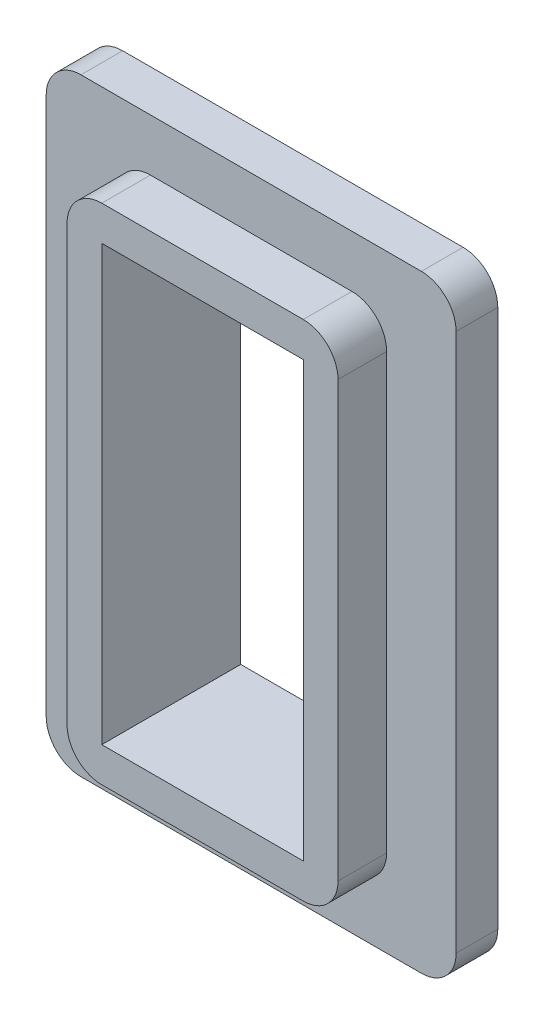
ISO-10303-21;
HEADER;
FILE_DESCRIPTION(('STEP AP214'),'2;1');
FILE_NAME('part.step','',(''),(''),'','','');
FILE_SCHEMA(('AUTOMOTIVE_DESIGN { 1 0 10303 214 1 1 1 1 }'));
ENDSEC;
DATA;
#1=APPLICATION_CONTEXT('core data for automotive mechanical design processes');
#2=APPLICATION_PROTOCOL_DEFINITION('international standard','automotive_design',2000,#1);
#3=PRODUCT_CONTEXT('',#1,'mechanical');
#4=PRODUCT('Part','Part','',(#3));
#5=PRODUCT_RELATED_PRODUCT_CATEGORY('part','',(#4));
#6=PRODUCT_DEFINITION_FORMATION('','',#4);
#7=PRODUCT_DEFINITION_CONTEXT('part definition',#1,'design');
#8=PRODUCT_DEFINITION('design','',#6,#7);
#9=PRODUCT_DEFINITION_SHAPE('','',#8);
#10=(LENGTH_UNIT() NAMED_UNIT(*) SI_UNIT(.MILLI.,.METRE.));
#11=(NAMED_UNIT(*) PLANE_ANGLE_UNIT() SI_UNIT($,.RADIAN.));
#12=(NAMED_UNIT(*) SI_UNIT($,.STERADIAN.) SOLID_ANGLE_UNIT());
#13=UNCERTAINTY_MEASURE_WITH_UNIT(LENGTH_MEASURE(1.E-05),#10,'distance_accuracy_value','');
#14=(GEOMETRIC_REPRESENTATION_CONTEXT(3) GLOBAL_UNCERTAINTY_ASSIGNED_CONTEXT((#13)) GLOBAL_UNIT_ASSIGNED_CONTEXT((#10,
#11,#12)) REPRESENTATION_CONTEXT('',''));
#15=CARTESIAN_POINT('',(0.,0.,0.));
#16=DIRECTION('',(0.,0.,1.));
#17=DIRECTION('',(1.,0.,0.));
#18=AXIS2_PLACEMENT_3D('',#15,#16,#17);
#19=CARTESIAN_POINT('',(0.,0.,-0.6));
#20=DIRECTION('',(0.,0.,1.));
#21=DIRECTION('',(1.,0.,0.));
#22=AXIS2_PLACEMENT_3D('',#19,#20,#21);
#23=PLANE('',#22);
#24=DIRECTION('',(-1.,0.,0.));
#25=VECTOR('',#24,1.);
#26=CARTESIAN_POINT('',(0.,-8.75,-0.6));
#27=LINE('',#26,#25);
#28=CARTESIAN_POINT('',(4.9,-8.75,-0.6));
#29=VERTEX_POINT('',#28);
#30=CARTESIAN_POINT('',(-4.9,-8.75,-0.6));
#31=VERTEX_POINT('',#30);
#32=EDGE_CURVE('E360',#29,#31,#27,.T.);
#33=ORIENTED_EDGE('',*,*,#32,.T.);
#34=CARTESIAN_POINT('',(-4.9,-7.75,-0.6));
#35=DIRECTION('',(0.,0.,1.));
#36=DIRECTION('',(1.,0.,0.));
#37=AXIS2_PLACEMENT_3D('',#34,#35,#36);
#38=CIRCLE('',#37,1.);
#39=CARTESIAN_POINT('',(-5.9,-7.75,-0.6));
#40=VERTEX_POINT('',#39);
#41=EDGE_CURVE('E433',#31,#40,#38,.F.);
#42=ORIENTED_EDGE('',*,*,#41,.T.);
#43=DIRECTION('',(0.,1.,0.));
#44=VECTOR('',#43,1.);
#45=CARTESIAN_POINT('',(-5.9,0.,-0.6));
#46=LINE('',#45,#44);
#47=CARTESIAN_POINT('',(-5.9,7.75,-0.6));
#48=VERTEX_POINT('',#47);
#49=EDGE_CURVE('E357',#40,#48,#46,.T.);
#50=ORIENTED_EDGE('',*,*,#49,.T.);
#51=CARTESIAN_POINT('',(-4.9,7.75,-0.6));
#52=DIRECTION('',(0.,0.,1.));
#53=DIRECTION('',(1.,0.,0.));
#54=AXIS2_PLACEMENT_3D('',#51,#52,#53);
#55=CIRCLE('',#54,1.);
#56=CARTESIAN_POINT('',(-4.9,8.75,-0.6));
#57=VERTEX_POINT('',#56);
#58=EDGE_CURVE('E427',#48,#57,#55,.F.);
#59=ORIENTED_EDGE('',*,*,#58,.T.);
#60=DIRECTION('',(-1.,0.,0.));
#61=VECTOR('',#60,1.);
#62=CARTESIAN_POINT('',(0.,8.75,-0.6));
#63=LINE('',#62,#61);
#64=CARTESIAN_POINT('',(4.9,8.75,-0.6));
#65=VERTEX_POINT('',#64);
#66=EDGE_CURVE('E366',#65,#57,#63,.T.);
#67=ORIENTED_EDGE('',*,*,#66,.F.);
#68=CARTESIAN_POINT('',(4.9,7.75,-0.6));
#69=DIRECTION('',(0.,0.,1.));
#70=DIRECTION('',(1.,0.,0.));
#71=AXIS2_PLACEMENT_3D('',#68,#69,#70);
#72=CIRCLE('',#71,1.);
#73=CARTESIAN_POINT('',(5.9,7.75,-0.6));
#74=VERTEX_POINT('',#73);
#75=EDGE_CURVE('E429',#65,#74,#72,.F.);
#76=ORIENTED_EDGE('',*,*,#75,.T.);
#77=DIRECTION('',(0.,1.,0.));
#78=VECTOR('',#77,1.);
#79=CARTESIAN_POINT('',(5.9,0.,-0.6));
#80=LINE('',#79,#78);
#81=CARTESIAN_POINT('',(5.9,-7.75,-0.6));
#82=VERTEX_POINT('',#81);
#83=EDGE_CURVE('E363',#82,#74,#80,.T.);
#84=ORIENTED_EDGE('',*,*,#83,.F.);
#85=CARTESIAN_POINT('',(4.9,-7.75,-0.6));
#86=DIRECTION('',(0.,0.,1.));
#87=DIRECTION('',(1.,0.,0.));
#88=AXIS2_PLACEMENT_3D('',#85,#86,#87);
#89=CIRCLE('',#88,1.);
#90=EDGE_CURVE('E431',#82,#29,#89,.F.);
#91=ORIENTED_EDGE('',*,*,#90,.T.);
#92=EDGE_LOOP('',(#33,#42,#50,#59,#67,#76,#84,#91));
#93=FACE_BOUND('',#92,.T.);
#94=DIRECTION('',(0.,1.,0.));
#95=VECTOR('',#94,1.);
#96=CARTESIAN_POINT('',(-3.9,0.,-0.6));
#97=LINE('',#96,#95);
#98=CARTESIAN_POINT('',(-3.9,-6.25,-0.6));
#99=VERTEX_POINT('',#98);
#100=CARTESIAN_POINT('',(-3.9,6.25,-0.6));
#101=VERTEX_POINT('',#100);
#102=EDGE_CURVE('E342',#99,#101,#97,.T.);
#103=ORIENTED_EDGE('',*,*,#102,.F.);
#104=CARTESIAN_POINT('',(-2.9,-6.25,-0.6));
#105=DIRECTION('',(0.,0.,1.));
#106=DIRECTION('',(1.,0.,0.));
#107=AXIS2_PLACEMENT_3D('',#104,#105,#106);
#108=CIRCLE('',#107,1.);
#109=CARTESIAN_POINT('',(-2.9,-7.25,-0.6));
#110=VERTEX_POINT('',#109);
#111=EDGE_CURVE('E476',#99,#110,#108,.T.);
#112=ORIENTED_EDGE('',*,*,#111,.T.);
#113=DIRECTION('',(1.,0.,0.));
#114=VECTOR('',#113,1.);
#115=CARTESIAN_POINT('',(0.,-7.25,-0.6));
#116=LINE('',#115,#114);
#117=CARTESIAN_POINT('',(2.9,-7.25,-0.6));
#118=VERTEX_POINT('',#117);
#119=EDGE_CURVE('E333',#110,#118,#116,.T.);
#120=ORIENTED_EDGE('',*,*,#119,.T.);
#121=CARTESIAN_POINT('',(2.9,-6.25,-0.6));
#122=DIRECTION('',(0.,0.,1.));
#123=DIRECTION('',(1.,0.,0.));
#124=AXIS2_PLACEMENT_3D('',#121,#122,#123);
#125=CIRCLE('',#124,1.);
#126=CARTESIAN_POINT('',(3.9,-6.25,-0.6));
#127=VERTEX_POINT('',#126);
#128=EDGE_CURVE('E474',#118,#127,#125,.T.);
#129=ORIENTED_EDGE('',*,*,#128,.T.);
#130=DIRECTION('',(0.,1.,0.));
#131=VECTOR('',#130,1.);
#132=CARTESIAN_POINT('',(3.9,0.,-0.6));
#133=LINE('',#132,#131);
#134=CARTESIAN_POINT('',(3.9,6.25,-0.6));
#135=VERTEX_POINT('',#134);
#136=EDGE_CURVE('E336',#127,#135,#133,.T.);
#137=ORIENTED_EDGE('',*,*,#136,.T.);
#138=CARTESIAN_POINT('',(2.9,6.25,-0.6));
#139=DIRECTION('',(0.,0.,1.));
#140=DIRECTION('',(1.,0.,0.));
#141=AXIS2_PLACEMENT_3D('',#138,#139,#140);
#142=CIRCLE('',#141,1.);
#143=CARTESIAN_POINT('',(2.9,7.25,-0.6));
#144=VERTEX_POINT('',#143);
#145=EDGE_CURVE('E472',#135,#144,#142,.T.);
#146=ORIENTED_EDGE('',*,*,#145,.T.);
#147=DIRECTION('',(1.,0.,0.));
#148=VECTOR('',#147,1.);
#149=CARTESIAN_POINT('',(0.,7.25,-0.6));
#150=LINE('',#149,#148);
#151=CARTESIAN_POINT('',(-2.9,7.25,-0.6));
#152=VERTEX_POINT('',#151);
#153=EDGE_CURVE('E339',#152,#144,#150,.T.);
#154=ORIENTED_EDGE('',*,*,#153,.F.);
#155=CARTESIAN_POINT('',(-2.9,6.25,-0.6));
#156=DIRECTION('',(0.,0.,1.));
#157=DIRECTION('',(1.,0.,0.));
#158=AXIS2_PLACEMENT_3D('',#155,#156,#157);
#159=CIRCLE('',#158,1.);
#160=EDGE_CURVE('E470',#152,#101,#159,.T.);
#161=ORIENTED_EDGE('',*,*,#160,.T.);
#162=EDGE_LOOP('',(#103,#112,#120,#129,#137,#146,#154,#161));
#163=FACE_BOUND('',#162,.T.);
#164=ADVANCED_FACE('F83',(#93,#163),#23,.F.);
#165=CARTESIAN_POINT('',(0.,0.,0.6));
#166=DIRECTION('',(0.,0.,1.));
#167=DIRECTION('',(1.,0.,0.));
#168=AXIS2_PLACEMENT_3D('',#165,#166,#167);
#169=PLANE('',#168);
#170=DIRECTION('',(0.,1.,0.));
#171=VECTOR('',#170,1.);
#172=CARTESIAN_POINT('',(-5.9,0.,0.6));
#173=LINE('',#172,#171);
#174=CARTESIAN_POINT('',(-5.9,-7.75,0.6));
#175=VERTEX_POINT('',#174);
#176=CARTESIAN_POINT('',(-5.9,7.75,0.6));
#177=VERTEX_POINT('',#176);
#178=EDGE_CURVE('E345',#175,#177,#173,.T.);
#179=ORIENTED_EDGE('',*,*,#178,.F.);
#180=CARTESIAN_POINT('',(-4.9,-7.75,0.6));
#181=DIRECTION('',(0.,0.,1.));
#182=DIRECTION('',(1.,0.,0.));
#183=AXIS2_PLACEMENT_3D('',#180,#181,#182);
#184=CIRCLE('',#183,1.);
#185=CARTESIAN_POINT('',(-4.9,-8.75,0.6));
#186=VERTEX_POINT('',#185);
#187=EDGE_CURVE('E420',#175,#186,#184,.T.);
#188=ORIENTED_EDGE('',*,*,#187,.T.);
#189=DIRECTION('',(-1.,0.,0.));
#190=VECTOR('',#189,1.);
#191=CARTESIAN_POINT('',(0.,-8.75,0.6));
#192=LINE('',#191,#190);
#193=CARTESIAN_POINT('',(4.9,-8.75,0.6));
#194=VERTEX_POINT('',#193);
#195=EDGE_CURVE('E348',#194,#186,#192,.T.);
#196=ORIENTED_EDGE('',*,*,#195,.F.);
#197=CARTESIAN_POINT('',(4.9,-7.75,0.6));
#198=DIRECTION('',(0.,0.,1.));
#199=DIRECTION('',(1.,0.,0.));
#200=AXIS2_PLACEMENT_3D('',#197,#198,#199);
#201=CIRCLE('',#200,1.);
#202=CARTESIAN_POINT('',(5.9,-7.75,0.6));
#203=VERTEX_POINT('',#202);
#204=EDGE_CURVE('E418',#194,#203,#201,.T.);
#205=ORIENTED_EDGE('',*,*,#204,.T.);
#206=DIRECTION('',(0.,1.,0.));
#207=VECTOR('',#206,1.);
#208=CARTESIAN_POINT('',(5.9,0.,0.6));
#209=LINE('',#208,#207);
#210=CARTESIAN_POINT('',(5.9,7.75,0.6));
#211=VERTEX_POINT('',#210);
#212=EDGE_CURVE('E351',#203,#211,#209,.T.);
#213=ORIENTED_EDGE('',*,*,#212,.T.);
#214=CARTESIAN_POINT('',(4.9,7.75,0.6));
#215=DIRECTION('',(0.,0.,1.));
#216=DIRECTION('',(1.,0.,0.));
#217=AXIS2_PLACEMENT_3D('',#214,#215,#216);
#218=CIRCLE('',#217,1.);
#219=CARTESIAN_POINT('',(4.9,8.75,0.6));
#220=VERTEX_POINT('',#219);
#221=EDGE_CURVE('E416',#211,#220,#218,.T.);
#222=ORIENTED_EDGE('',*,*,#221,.T.);
#223=DIRECTION('',(-1.,0.,0.));
#224=VECTOR('',#223,1.);
#225=CARTESIAN_POINT('',(0.,8.75,0.6));
#226=LINE('',#225,#224);
#227=CARTESIAN_POINT('',(-4.9,8.75,0.6));
#228=VERTEX_POINT('',#227);
#229=EDGE_CURVE('E354',#220,#228,#226,.T.);
#230=ORIENTED_EDGE('',*,*,#229,.T.);
#231=CARTESIAN_POINT('',(-4.9,7.75,0.6));
#232=DIRECTION('',(0.,0.,1.));
#233=DIRECTION('',(1.,0.,0.));
#234=AXIS2_PLACEMENT_3D('',#231,#232,#233);
#235=CIRCLE('',#234,1.);
#236=EDGE_CURVE('E414',#228,#177,#235,.T.);
#237=ORIENTED_EDGE('',*,*,#236,.T.);
#238=EDGE_LOOP('',(#179,#188,#196,#205,#213,#222,#230,#237));
#239=FACE_BOUND('',#238,.T.);
#240=DIRECTION('',(1.,0.,0.));
#241=VECTOR('',#240,1.);
#242=CARTESIAN_POINT('',(0.,-7.25,0.6));
#243=LINE('',#242,#241);
#244=CARTESIAN_POINT('',(-2.9,-7.25,0.6));
#245=VERTEX_POINT('',#244);
#246=CARTESIAN_POINT('',(2.9,-7.25,0.6));
#247=VERTEX_POINT('',#246);
#248=EDGE_CURVE('E369',#245,#247,#243,.T.);
#249=ORIENTED_EDGE('',*,*,#248,.F.);
#250=CARTESIAN_POINT('',(-2.9,-6.25,0.6));
#251=DIRECTION('',(0.,0.,1.));
#252=DIRECTION('',(1.,0.,0.));
#253=AXIS2_PLACEMENT_3D('',#250,#251,#252);
#254=CIRCLE('',#253,1.);
#255=CARTESIAN_POINT('',(-3.9,-6.25,0.6));
#256=VERTEX_POINT('',#255);
#257=EDGE_CURVE('E480',#245,#256,#254,.F.);
#258=ORIENTED_EDGE('',*,*,#257,.T.);
#259=DIRECTION('',(0.,1.,0.));
#260=VECTOR('',#259,1.);
#261=CARTESIAN_POINT('',(-3.9,0.,0.6));
#262=LINE('',#261,#260);
#263=CARTESIAN_POINT('',(-3.9,6.25,0.6));
#264=VERTEX_POINT('',#263);
#265=EDGE_CURVE('E378',#256,#264,#262,.T.);
#266=ORIENTED_EDGE('',*,*,#265,.T.);
#267=CARTESIAN_POINT('',(-2.9,6.25,0.6));
#268=DIRECTION('',(0.,0.,1.));
#269=DIRECTION('',(1.,0.,0.));
#270=AXIS2_PLACEMENT_3D('',#267,#268,#269);
#271=CIRCLE('',#270,1.);
#272=CARTESIAN_POINT('',(-2.9,7.25,0.6));
#273=VERTEX_POINT('',#272);
#274=EDGE_CURVE('E91',#264,#273,#271,.F.);
#275=ORIENTED_EDGE('',*,*,#274,.T.);
#276=DIRECTION('',(1.,0.,0.));
#277=VECTOR('',#276,1.);
#278=CARTESIAN_POINT('',(0.,7.25,0.6));
#279=LINE('',#278,#277);
#280=CARTESIAN_POINT('',(2.9,7.25,0.6));
#281=VERTEX_POINT('',#280);
#282=EDGE_CURVE('E375',#273,#281,#279,.T.);
#283=ORIENTED_EDGE('',*,*,#282,.T.);
#284=CARTESIAN_POINT('',(2.9,6.25,0.6));
#285=DIRECTION('',(0.,0.,1.));
#286=DIRECTION('',(1.,0.,0.));
#287=AXIS2_PLACEMENT_3D('',#284,#285,#286);
#288=CIRCLE('',#287,1.);
#289=CARTESIAN_POINT('',(3.9,6.25,0.6));
#290=VERTEX_POINT('',#289);
#291=EDGE_CURVE('E12',#281,#290,#288,.F.);
#292=ORIENTED_EDGE('',*,*,#291,.T.);
#293=DIRECTION('',(0.,1.,0.));
#294=VECTOR('',#293,1.);
#295=CARTESIAN_POINT('',(3.9,0.,0.6));
#296=LINE('',#295,#294);
#297=CARTESIAN_POINT('',(3.9,-6.25,0.6));
#298=VERTEX_POINT('',#297);
#299=EDGE_CURVE('E372',#298,#290,#296,.T.);
#300=ORIENTED_EDGE('',*,*,#299,.F.);
#301=CARTESIAN_POINT('',(2.9,-6.25,0.6));
#302=DIRECTION('',(0.,0.,1.));
#303=DIRECTION('',(1.,0.,0.));
#304=AXIS2_PLACEMENT_3D('',#301,#302,#303);
#305=CIRCLE('',#304,1.);
#306=EDGE_CURVE('E478',#298,#247,#305,.F.);
#307=ORIENTED_EDGE('',*,*,#306,.T.);
#308=EDGE_LOOP('',(#249,#258,#266,#275,#283,#292,#300,#307));
#309=FACE_BOUND('',#308,.T.);
#310=ADVANCED_FACE('F485',(#239,#309),#169,.T.);
#311=CARTESIAN_POINT('',(-5.9,0.,-0.6));
#312=DIRECTION('',(1.,0.,0.));
#313=DIRECTION('',(0.,0.,-1.));
#314=AXIS2_PLACEMENT_3D('',#311,#312,#313);
#315=PLANE('',#314);
#316=ORIENTED_EDGE('',*,*,#49,.F.);
#317=DIRECTION('',(0.,0.,1.));
#318=VECTOR('',#317,1.);
#319=CARTESIAN_POINT('',(-5.9,-7.75,-0.6));
#320=LINE('',#319,#318);
#321=EDGE_CURVE('E411',#40,#175,#320,.T.);
#322=ORIENTED_EDGE('',*,*,#321,.T.);
#323=ORIENTED_EDGE('',*,*,#178,.T.);
#324=DIRECTION('',(0.,0.,1.));
#325=VECTOR('',#324,1.);
#326=CARTESIAN_POINT('',(-5.9,7.75,-0.6));
#327=LINE('',#326,#325);
#328=EDGE_CURVE('E409',#177,#48,#327,.F.);
#329=ORIENTED_EDGE('',*,*,#328,.T.);
#330=EDGE_LOOP('',(#316,#322,#323,#329));
#331=FACE_BOUND('',#330,.T.);
#332=ADVANCED_FACE('F512',(#331),#315,.F.);
#333=CARTESIAN_POINT('',(0.,8.75,-0.6));
#334=DIRECTION('',(0.,1.,0.));
#335=DIRECTION('',(0.,0.,1.));
#336=AXIS2_PLACEMENT_3D('',#333,#334,#335);
#337=PLANE('',#336);
#338=ORIENTED_EDGE('',*,*,#229,.F.);
#339=DIRECTION('',(0.,0.,1.));
#340=VECTOR('',#339,1.);
#341=CARTESIAN_POINT('',(4.9,8.75,-0.6));
#342=LINE('',#341,#340);
#343=EDGE_CURVE('E468',#220,#65,#342,.F.);
#344=ORIENTED_EDGE('',*,*,#343,.T.);
#345=ORIENTED_EDGE('',*,*,#66,.T.);
#346=DIRECTION('',(0.,0.,1.));
#347=VECTOR('',#346,1.);
#348=CARTESIAN_POINT('',(-4.9,8.75,0.6));
#349=LINE('',#348,#347);
#350=EDGE_CURVE('E465',#57,#228,#349,.T.);
#351=ORIENTED_EDGE('',*,*,#350,.T.);
#352=EDGE_LOOP('',(#338,#344,#345,#351));
#353=FACE_BOUND('',#352,.T.);
#354=ADVANCED_FACE('F518',(#353),#337,.T.);
#355=CARTESIAN_POINT('',(5.9,0.,-0.6));
#356=DIRECTION('',(1.,0.,0.));
#357=DIRECTION('',(0.,0.,-1.));
#358=AXIS2_PLACEMENT_3D('',#355,#356,#357);
#359=PLANE('',#358);
#360=ORIENTED_EDGE('',*,*,#212,.F.);
#361=DIRECTION('',(0.,0.,1.));
#362=VECTOR('',#361,1.);
#363=CARTESIAN_POINT('',(5.9,-7.75,-0.6));
#364=LINE('',#363,#362);
#365=EDGE_CURVE('E438',#203,#82,#364,.F.);
#366=ORIENTED_EDGE('',*,*,#365,.T.);
#367=ORIENTED_EDGE('',*,*,#83,.T.);
#368=DIRECTION('',(0.,0.,1.));
#369=VECTOR('',#368,1.);
#370=CARTESIAN_POINT('',(5.9,7.75,-0.6));
#371=LINE('',#370,#369);
#372=EDGE_CURVE('E435',#74,#211,#371,.T.);
#373=ORIENTED_EDGE('',*,*,#372,.T.);
#374=EDGE_LOOP('',(#360,#366,#367,#373));
#375=FACE_BOUND('',#374,.T.);
#376=ADVANCED_FACE('F521',(#375),#359,.T.);
#377=CARTESIAN_POINT('',(0.,-8.75,-0.6));
#378=DIRECTION('',(0.,1.,0.));
#379=DIRECTION('',(0.,0.,1.));
#380=AXIS2_PLACEMENT_3D('',#377,#378,#379);
#381=PLANE('',#380);
#382=ORIENTED_EDGE('',*,*,#195,.T.);
#383=DIRECTION('',(0.,0.,1.));
#384=VECTOR('',#383,1.);
#385=CARTESIAN_POINT('',(-4.9,-8.75,-0.6));
#386=LINE('',#385,#384);
#387=EDGE_CURVE('E425',#186,#31,#386,.F.);
#388=ORIENTED_EDGE('',*,*,#387,.T.);
#389=ORIENTED_EDGE('',*,*,#32,.F.);
#390=DIRECTION('',(0.,0.,1.));
#391=VECTOR('',#390,1.);
#392=CARTESIAN_POINT('',(4.9,-8.75,0.6));
#393=LINE('',#392,#391);
#394=EDGE_CURVE('E422',#29,#194,#393,.T.);
#395=ORIENTED_EDGE('',*,*,#394,.T.);
#396=EDGE_LOOP('',(#382,#388,#389,#395));
#397=FACE_BOUND('',#396,.T.);
#398=ADVANCED_FACE('F525',(#397),#381,.F.);
#399=CARTESIAN_POINT('',(-3.9,-7.25,-2.));
#400=DIRECTION('',(0.,-1.,0.));
#401=DIRECTION('',(0.,0.,-1.));
#402=AXIS2_PLACEMENT_3D('',#399,#400,#401);
#403=PLANE('',#402);
#404=ORIENTED_EDGE('',*,*,#248,.T.);
#405=DIRECTION('',(0.,0.,1.));
#406=VECTOR('',#405,1.);
#407=CARTESIAN_POINT('',(2.9,-7.25,-2.));
#408=LINE('',#407,#406);
#409=CARTESIAN_POINT('',(2.9,-7.25,2.));
#410=VERTEX_POINT('',#409);
#411=EDGE_CURVE('E442',#247,#410,#408,.T.);
#412=ORIENTED_EDGE('',*,*,#411,.T.);
#413=DIRECTION('',(1.,0.,0.));
#414=VECTOR('',#413,1.);
#415=CARTESIAN_POINT('',(-3.9,-7.25,2.));
#416=LINE('',#415,#414);
#417=CARTESIAN_POINT('',(-2.9,-7.25,2.));
#418=VERTEX_POINT('',#417);
#419=EDGE_CURVE('E305',#418,#410,#416,.T.);
#420=ORIENTED_EDGE('',*,*,#419,.F.);
#421=DIRECTION('',(0.,0.,1.));
#422=VECTOR('',#421,1.);
#423=CARTESIAN_POINT('',(-2.9,-7.25,0.6));
#424=LINE('',#423,#422);
#425=EDGE_CURVE('E440',#418,#245,#424,.F.);
#426=ORIENTED_EDGE('',*,*,#425,.T.);
#427=EDGE_LOOP('',(#404,#412,#420,#426));
#428=FACE_BOUND('',#427,.T.);
#429=ADVANCED_FACE('F529',(#428),#403,.T.);
#430=CARTESIAN_POINT('',(3.9,-7.25,-2.));
#431=DIRECTION('',(1.,0.,0.));
#432=DIRECTION('',(0.,0.,-1.));
#433=AXIS2_PLACEMENT_3D('',#430,#431,#432);
#434=PLANE('',#433);
#435=DIRECTION('',(0.,1.,0.));
#436=VECTOR('',#435,1.);
#437=CARTESIAN_POINT('',(3.9,-7.25,2.));
#438=LINE('',#437,#436);
#439=CARTESIAN_POINT('',(3.9,-6.25,2.));
#440=VERTEX_POINT('',#439);
#441=CARTESIAN_POINT('',(3.9,6.25,2.));
#442=VERTEX_POINT('',#441);
#443=EDGE_CURVE('E303',#440,#442,#438,.T.);
#444=ORIENTED_EDGE('',*,*,#443,.F.);
#445=DIRECTION('',(0.,0.,1.));
#446=VECTOR('',#445,1.);
#447=CARTESIAN_POINT('',(3.9,-6.25,-2.));
#448=LINE('',#447,#446);
#449=EDGE_CURVE('E454',#440,#298,#448,.F.);
#450=ORIENTED_EDGE('',*,*,#449,.T.);
#451=ORIENTED_EDGE('',*,*,#299,.T.);
#452=DIRECTION('',(0.,0.,1.));
#453=VECTOR('',#452,1.);
#454=CARTESIAN_POINT('',(3.9,6.25,2.));
#455=LINE('',#454,#453);
#456=EDGE_CURVE('E451',#290,#442,#455,.T.);
#457=ORIENTED_EDGE('',*,*,#456,.T.);
#458=EDGE_LOOP('',(#444,#450,#451,#457));
#459=FACE_BOUND('',#458,.T.);
#460=ADVANCED_FACE('F578',(#459),#434,.T.);
#461=CARTESIAN_POINT('',(-3.9,7.25,-2.));
#462=DIRECTION('',(0.,-1.,0.));
#463=DIRECTION('',(0.,0.,-1.));
#464=AXIS2_PLACEMENT_3D('',#461,#462,#463);
#465=PLANE('',#464);
#466=ORIENTED_EDGE('',*,*,#282,.F.);
#467=DIRECTION('',(0.,0.,1.));
#468=VECTOR('',#467,1.);
#469=CARTESIAN_POINT('',(-2.9,7.25,-2.));
#470=LINE('',#469,#468);
#471=CARTESIAN_POINT('',(-2.9,7.25,2.));
#472=VERTEX_POINT('',#471);
#473=EDGE_CURVE('E463',#273,#472,#470,.T.);
#474=ORIENTED_EDGE('',*,*,#473,.T.);
#475=DIRECTION('',(1.,0.,0.));
#476=VECTOR('',#475,1.);
#477=CARTESIAN_POINT('',(-3.9,7.25,2.));
#478=LINE('',#477,#476);
#479=CARTESIAN_POINT('',(2.9,7.25,2.));
#480=VERTEX_POINT('',#479);
#481=EDGE_CURVE('E301',#472,#480,#478,.T.);
#482=ORIENTED_EDGE('',*,*,#481,.T.);
#483=DIRECTION('',(0.,0.,1.));
#484=VECTOR('',#483,1.);
#485=CARTESIAN_POINT('',(2.9,7.25,0.6));
#486=LINE('',#485,#484);
#487=EDGE_CURVE('E461',#480,#281,#486,.F.);
#488=ORIENTED_EDGE('',*,*,#487,.T.);
#489=EDGE_LOOP('',(#466,#474,#482,#488));
#490=FACE_BOUND('',#489,.T.);
#491=ADVANCED_FACE('F489',(#490),#465,.F.);
#492=CARTESIAN_POINT('',(-3.9,-7.25,-2.));
#493=DIRECTION('',(1.,0.,0.));
#494=DIRECTION('',(0.,0.,-1.));
#495=AXIS2_PLACEMENT_3D('',#492,#493,#494);
#496=PLANE('',#495);
#497=ORIENTED_EDGE('',*,*,#265,.F.);
#498=DIRECTION('',(0.,0.,1.));
#499=VECTOR('',#498,1.);
#500=CARTESIAN_POINT('',(-3.9,-6.25,2.));
#501=LINE('',#500,#499);
#502=CARTESIAN_POINT('',(-3.9,-6.25,2.));
#503=VERTEX_POINT('',#502);
#504=EDGE_CURVE('E458',#256,#503,#501,.T.);
#505=ORIENTED_EDGE('',*,*,#504,.T.);
#506=DIRECTION('',(0.,1.,0.));
#507=VECTOR('',#506,1.);
#508=CARTESIAN_POINT('',(-3.9,-7.25,2.));
#509=LINE('',#508,#507);
#510=CARTESIAN_POINT('',(-3.9,6.25,2.));
#511=VERTEX_POINT('',#510);
#512=EDGE_CURVE('E298',#503,#511,#509,.T.);
#513=ORIENTED_EDGE('',*,*,#512,.T.);
#514=DIRECTION('',(0.,0.,1.));
#515=VECTOR('',#514,1.);
#516=CARTESIAN_POINT('',(-3.9,6.25,-2.));
#517=LINE('',#516,#515);
#518=EDGE_CURVE('E456',#511,#264,#517,.F.);
#519=ORIENTED_EDGE('',*,*,#518,.T.);
#520=EDGE_LOOP('',(#497,#505,#513,#519));
#521=FACE_BOUND('',#520,.T.);
#522=ADVANCED_FACE('F573',(#521),#496,.F.);
#523=CARTESIAN_POINT('',(0.,0.,2.));
#524=DIRECTION('',(0.,0.,-1.));
#525=DIRECTION('',(-1.,0.,0.));
#526=AXIS2_PLACEMENT_3D('',#523,#524,#525);
#527=PLANE('',#526);
#528=DIRECTION('',(1.,0.,0.));
#529=VECTOR('',#528,1.);
#530=CARTESIAN_POINT('',(-2.9,-6.25,2.));
#531=LINE('',#530,#529);
#532=CARTESIAN_POINT('',(-2.9,-6.25,2.));
#533=VERTEX_POINT('',#532);
#534=CARTESIAN_POINT('',(2.9,-6.25,2.));
#535=VERTEX_POINT('',#534);
#536=EDGE_CURVE('E293',#533,#535,#531,.T.);
#537=ORIENTED_EDGE('',*,*,#536,.F.);
#538=DIRECTION('',(0.,1.,0.));
#539=VECTOR('',#538,1.);
#540=CARTESIAN_POINT('',(-2.9,-6.25,2.));
#541=LINE('',#540,#539);
#542=CARTESIAN_POINT('',(-2.9,6.25,2.));
#543=VERTEX_POINT('',#542);
#544=EDGE_CURVE('E273',#533,#543,#541,.T.);
#545=ORIENTED_EDGE('',*,*,#544,.T.);
#546=DIRECTION('',(1.,0.,0.));
#547=VECTOR('',#546,1.);
#548=CARTESIAN_POINT('',(-2.9,6.25,2.));
#549=LINE('',#548,#547);
#550=CARTESIAN_POINT('',(2.9,6.25,2.));
#551=VERTEX_POINT('',#550);
#552=EDGE_CURVE('E283',#543,#551,#549,.T.);
#553=ORIENTED_EDGE('',*,*,#552,.T.);
#554=DIRECTION('',(0.,1.,0.));
#555=VECTOR('',#554,1.);
#556=CARTESIAN_POINT('',(2.9,-6.25,2.));
#557=LINE('',#556,#555);
#558=EDGE_CURVE('E289',#535,#551,#557,.T.);
#559=ORIENTED_EDGE('',*,*,#558,.F.);
#560=EDGE_LOOP('',(#537,#545,#553,#559));
#561=FACE_BOUND('',#560,.T.);
#562=ORIENTED_EDGE('',*,*,#419,.T.);
#563=CARTESIAN_POINT('',(2.9,-6.25,2.));
#564=DIRECTION('',(0.,0.,-1.));
#565=DIRECTION('',(-1.,0.,0.));
#566=AXIS2_PLACEMENT_3D('',#563,#564,#565);
#567=CIRCLE('',#566,1.);
#568=EDGE_CURVE('E449',#410,#440,#567,.F.);
#569=ORIENTED_EDGE('',*,*,#568,.T.);
#570=ORIENTED_EDGE('',*,*,#443,.T.);
#571=CARTESIAN_POINT('',(2.9,6.25,2.));
#572=DIRECTION('',(0.,0.,-1.));
#573=DIRECTION('',(-1.,0.,0.));
#574=AXIS2_PLACEMENT_3D('',#571,#572,#573);
#575=CIRCLE('',#574,1.);
#576=EDGE_CURVE('E98',#442,#480,#575,.F.);
#577=ORIENTED_EDGE('',*,*,#576,.T.);
#578=ORIENTED_EDGE('',*,*,#481,.F.);
#579=CARTESIAN_POINT('',(-2.9,6.25,2.));
#580=DIRECTION('',(0.,0.,-1.));
#581=DIRECTION('',(-1.,0.,0.));
#582=AXIS2_PLACEMENT_3D('',#579,#580,#581);
#583=CIRCLE('',#582,1.);
#584=EDGE_CURVE('E106',#472,#511,#583,.F.);
#585=ORIENTED_EDGE('',*,*,#584,.T.);
#586=ORIENTED_EDGE('',*,*,#512,.F.);
#587=CARTESIAN_POINT('',(-2.9,-6.25,2.));
#588=DIRECTION('',(0.,0.,-1.));
#589=DIRECTION('',(-1.,0.,0.));
#590=AXIS2_PLACEMENT_3D('',#587,#588,#589);
#591=CIRCLE('',#590,1.);
#592=EDGE_CURVE('E447',#503,#418,#591,.F.);
#593=ORIENTED_EDGE('',*,*,#592,.T.);
#594=EDGE_LOOP('',(#562,#569,#570,#577,#578,#585,#586,#593));
#595=FACE_BOUND('',#594,.T.);
#596=ADVANCED_FACE('F291',(#561,#595),#527,.F.);
#597=ORIENTED_EDGE('',*,*,#102,.T.);
#598=DIRECTION('',(0.,0.,1.));
#599=VECTOR('',#598,1.);
#600=CARTESIAN_POINT('',(-3.9,6.25,-2.));
#601=LINE('',#600,#599);
#602=CARTESIAN_POINT('',(-3.9,6.25,-2.));
#603=VERTEX_POINT('',#602);
#604=EDGE_CURVE('E389',#101,#603,#601,.F.);
#605=ORIENTED_EDGE('',*,*,#604,.T.);
#606=DIRECTION('',(0.,1.,0.));
#607=VECTOR('',#606,1.);
#608=CARTESIAN_POINT('',(-3.9,-7.25,-2.));
#609=LINE('',#608,#607);
#610=CARTESIAN_POINT('',(-3.9,-6.25,-2.));
#611=VERTEX_POINT('',#610);
#612=EDGE_CURVE('E279',#611,#603,#609,.T.);
#613=ORIENTED_EDGE('',*,*,#612,.F.);
#614=DIRECTION('',(0.,0.,1.));
#615=VECTOR('',#614,1.);
#616=CARTESIAN_POINT('',(-3.9,-6.25,-0.6));
#617=LINE('',#616,#615);
#618=EDGE_CURVE('E386',#611,#99,#617,.T.);
#619=ORIENTED_EDGE('',*,*,#618,.T.);
#620=EDGE_LOOP('',(#597,#605,#613,#619));
#621=FACE_BOUND('',#620,.T.);
#622=ADVANCED_FACE('F597',(#621),#496,.F.);
#623=DIRECTION('',(1.,0.,0.));
#624=VECTOR('',#623,1.);
#625=CARTESIAN_POINT('',(-3.9,7.25,-2.));
#626=LINE('',#625,#624);
#627=CARTESIAN_POINT('',(-2.9,7.25,-2.));
#628=VERTEX_POINT('',#627);
#629=CARTESIAN_POINT('',(2.9,7.25,-2.));
#630=VERTEX_POINT('',#629);
#631=EDGE_CURVE('E324',#628,#630,#626,.T.);
#632=ORIENTED_EDGE('',*,*,#631,.F.);
#633=DIRECTION('',(0.,0.,1.));
#634=VECTOR('',#633,1.);
#635=CARTESIAN_POINT('',(-2.9,7.25,-2.));
#636=LINE('',#635,#634);
#637=EDGE_CURVE('E383',#628,#152,#636,.T.);
#638=ORIENTED_EDGE('',*,*,#637,.T.);
#639=ORIENTED_EDGE('',*,*,#153,.T.);
#640=DIRECTION('',(0.,0.,1.));
#641=VECTOR('',#640,1.);
#642=CARTESIAN_POINT('',(2.9,7.25,-2.));
#643=LINE('',#642,#641);
#644=EDGE_CURVE('E381',#144,#630,#643,.F.);
#645=ORIENTED_EDGE('',*,*,#644,.T.);
#646=EDGE_LOOP('',(#632,#638,#639,#645));
#647=FACE_BOUND('',#646,.T.);
#648=ADVANCED_FACE('F587',(#647),#465,.F.);
#649=DIRECTION('',(0.,1.,0.));
#650=VECTOR('',#649,1.);
#651=CARTESIAN_POINT('',(3.9,-7.25,-2.));
#652=LINE('',#651,#650);
#653=CARTESIAN_POINT('',(3.9,-6.25,-2.));
#654=VERTEX_POINT('',#653);
#655=CARTESIAN_POINT('',(3.9,6.25,-2.));
#656=VERTEX_POINT('',#655);
#657=EDGE_CURVE('E327',#654,#656,#652,.T.);
#658=ORIENTED_EDGE('',*,*,#657,.T.);
#659=DIRECTION('',(0.,0.,1.));
#660=VECTOR('',#659,1.);
#661=CARTESIAN_POINT('',(3.9,6.25,-0.6));
#662=LINE('',#661,#660);
#663=EDGE_CURVE('E401',#656,#135,#662,.T.);
#664=ORIENTED_EDGE('',*,*,#663,.T.);
#665=ORIENTED_EDGE('',*,*,#136,.F.);
#666=DIRECTION('',(0.,0.,1.));
#667=VECTOR('',#666,1.);
#668=CARTESIAN_POINT('',(3.9,-6.25,-2.));
#669=LINE('',#668,#667);
#670=EDGE_CURVE('E399',#127,#654,#669,.F.);
#671=ORIENTED_EDGE('',*,*,#670,.T.);
#672=EDGE_LOOP('',(#658,#664,#665,#671));
#673=FACE_BOUND('',#672,.T.);
#674=ADVANCED_FACE('F581',(#673),#434,.T.);
#675=DIRECTION('',(1.,0.,0.));
#676=VECTOR('',#675,1.);
#677=CARTESIAN_POINT('',(-3.9,-7.25,-2.));
#678=LINE('',#677,#676);
#679=CARTESIAN_POINT('',(-2.9,-7.25,-2.));
#680=VERTEX_POINT('',#679);
#681=CARTESIAN_POINT('',(2.9,-7.25,-2.));
#682=VERTEX_POINT('',#681);
#683=EDGE_CURVE('E330',#680,#682,#678,.T.);
#684=ORIENTED_EDGE('',*,*,#683,.T.);
#685=DIRECTION('',(0.,0.,1.));
#686=VECTOR('',#685,1.);
#687=CARTESIAN_POINT('',(2.9,-7.25,-2.));
#688=LINE('',#687,#686);
#689=EDGE_CURVE('E406',#682,#118,#688,.T.);
#690=ORIENTED_EDGE('',*,*,#689,.T.);
#691=ORIENTED_EDGE('',*,*,#119,.F.);
#692=DIRECTION('',(0.,0.,1.));
#693=VECTOR('',#692,1.);
#694=CARTESIAN_POINT('',(-2.9,-7.25,-2.));
#695=LINE('',#694,#693);
#696=EDGE_CURVE('E404',#110,#680,#695,.F.);
#697=ORIENTED_EDGE('',*,*,#696,.T.);
#698=EDGE_LOOP('',(#684,#690,#691,#697));
#699=FACE_BOUND('',#698,.T.);
#700=ADVANCED_FACE('F589',(#699),#403,.T.);
#701=CARTESIAN_POINT('',(-2.9,-6.25,-2.));
#702=DIRECTION('',(1.,0.,0.));
#703=DIRECTION('',(0.,0.,-1.));
#704=AXIS2_PLACEMENT_3D('',#701,#702,#703);
#705=PLANE('',#704);
#706=DIRECTION('',(0.,0.,1.));
#707=VECTOR('',#706,1.);
#708=CARTESIAN_POINT('',(-2.9,6.25,-2.));
#709=LINE('',#708,#707);
#710=CARTESIAN_POINT('',(-2.9,6.25,-2.));
#711=VERTEX_POINT('',#710);
#712=EDGE_CURVE('E269',#711,#543,#709,.T.);
#713=ORIENTED_EDGE('',*,*,#712,.T.);
#714=ORIENTED_EDGE('',*,*,#544,.F.);
#715=DIRECTION('',(0.,0.,1.));
#716=VECTOR('',#715,1.);
#717=CARTESIAN_POINT('',(-2.9,-6.25,-2.));
#718=LINE('',#717,#716);
#719=CARTESIAN_POINT('',(-2.9,-6.25,-2.));
#720=VERTEX_POINT('',#719);
#721=EDGE_CURVE('E317',#720,#533,#718,.T.);
#722=ORIENTED_EDGE('',*,*,#721,.F.);
#723=DIRECTION('',(0.,1.,0.));
#724=VECTOR('',#723,1.);
#725=CARTESIAN_POINT('',(-2.9,-6.25,-2.));
#726=LINE('',#725,#724);
#727=EDGE_CURVE('E276',#720,#711,#726,.T.);
#728=ORIENTED_EDGE('',*,*,#727,.T.);
#729=EDGE_LOOP('',(#713,#714,#722,#728));
#730=FACE_BOUND('',#729,.T.);
#731=ADVANCED_FACE('F271',(#730),#705,.T.);
#732=CARTESIAN_POINT('',(-2.9,6.25,-2.));
#733=DIRECTION('',(0.,-1.,0.));
#734=DIRECTION('',(0.,0.,-1.));
#735=AXIS2_PLACEMENT_3D('',#732,#733,#734);
#736=PLANE('',#735);
#737=DIRECTION('',(0.,0.,1.));
#738=VECTOR('',#737,1.);
#739=CARTESIAN_POINT('',(2.9,6.25,-2.));
#740=LINE('',#739,#738);
#741=CARTESIAN_POINT('',(2.9,6.25,-2.));
#742=VERTEX_POINT('',#741);
#743=EDGE_CURVE('E280',#742,#551,#740,.T.);
#744=ORIENTED_EDGE('',*,*,#743,.T.);
#745=ORIENTED_EDGE('',*,*,#552,.F.);
#746=ORIENTED_EDGE('',*,*,#712,.F.);
#747=DIRECTION('',(1.,0.,0.));
#748=VECTOR('',#747,1.);
#749=CARTESIAN_POINT('',(-2.9,6.25,-2.));
#750=LINE('',#749,#748);
#751=EDGE_CURVE('E309',#711,#742,#750,.T.);
#752=ORIENTED_EDGE('',*,*,#751,.T.);
#753=EDGE_LOOP('',(#744,#745,#746,#752));
#754=FACE_BOUND('',#753,.T.);
#755=ADVANCED_FACE('F284',(#754),#736,.T.);
#756=CARTESIAN_POINT('',(2.9,-6.25,-2.));
#757=DIRECTION('',(1.,0.,0.));
#758=DIRECTION('',(0.,0.,-1.));
#759=AXIS2_PLACEMENT_3D('',#756,#757,#758);
#760=PLANE('',#759);
#761=DIRECTION('',(0.,0.,1.));
#762=VECTOR('',#761,1.);
#763=CARTESIAN_POINT('',(2.9,-6.25,-2.));
#764=LINE('',#763,#762);
#765=CARTESIAN_POINT('',(2.9,-6.25,-2.));
#766=VERTEX_POINT('',#765);
#767=EDGE_CURVE('E319',#766,#535,#764,.T.);
#768=ORIENTED_EDGE('',*,*,#767,.T.);
#769=ORIENTED_EDGE('',*,*,#558,.T.);
#770=ORIENTED_EDGE('',*,*,#743,.F.);
#771=DIRECTION('',(0.,1.,0.));
#772=VECTOR('',#771,1.);
#773=CARTESIAN_POINT('',(2.9,-6.25,-2.));
#774=LINE('',#773,#772);
#775=EDGE_CURVE('E311',#766,#742,#774,.T.);
#776=ORIENTED_EDGE('',*,*,#775,.F.);
#777=EDGE_LOOP('',(#768,#769,#770,#776));
#778=FACE_BOUND('',#777,.T.);
#779=ADVANCED_FACE('F626',(#778),#760,.F.);
#780=CARTESIAN_POINT('',(-2.9,-6.25,-2.));
#781=DIRECTION('',(0.,-1.,0.));
#782=DIRECTION('',(0.,0.,-1.));
#783=AXIS2_PLACEMENT_3D('',#780,#781,#782);
#784=PLANE('',#783);
#785=ORIENTED_EDGE('',*,*,#721,.T.);
#786=ORIENTED_EDGE('',*,*,#536,.T.);
#787=ORIENTED_EDGE('',*,*,#767,.F.);
#788=DIRECTION('',(1.,0.,0.));
#789=VECTOR('',#788,1.);
#790=CARTESIAN_POINT('',(-2.9,-6.25,-2.));
#791=LINE('',#790,#789);
#792=EDGE_CURVE('E314',#720,#766,#791,.T.);
#793=ORIENTED_EDGE('',*,*,#792,.F.);
#794=EDGE_LOOP('',(#785,#786,#787,#793));
#795=FACE_BOUND('',#794,.T.);
#796=ADVANCED_FACE('F623',(#795),#784,.F.);
#797=CARTESIAN_POINT('',(0.,0.,-2.));
#798=DIRECTION('',(0.,0.,-1.));
#799=DIRECTION('',(-1.,0.,0.));
#800=AXIS2_PLACEMENT_3D('',#797,#798,#799);
#801=PLANE('',#800);
#802=ORIENTED_EDGE('',*,*,#612,.T.);
#803=CARTESIAN_POINT('',(-2.9,6.25,-2.));
#804=DIRECTION('',(0.,0.,-1.));
#805=DIRECTION('',(-1.,0.,0.));
#806=AXIS2_PLACEMENT_3D('',#803,#804,#805);
#807=CIRCLE('',#806,1.);
#808=EDGE_CURVE('E397',#603,#628,#807,.T.);
#809=ORIENTED_EDGE('',*,*,#808,.T.);
#810=ORIENTED_EDGE('',*,*,#631,.T.);
#811=CARTESIAN_POINT('',(2.9,6.25,-2.));
#812=DIRECTION('',(0.,0.,-1.));
#813=DIRECTION('',(-1.,0.,0.));
#814=AXIS2_PLACEMENT_3D('',#811,#812,#813);
#815=CIRCLE('',#814,1.);
#816=EDGE_CURVE('E395',#630,#656,#815,.T.);
#817=ORIENTED_EDGE('',*,*,#816,.T.);
#818=ORIENTED_EDGE('',*,*,#657,.F.);
#819=CARTESIAN_POINT('',(2.9,-6.25,-2.));
#820=DIRECTION('',(0.,0.,-1.));
#821=DIRECTION('',(-1.,0.,0.));
#822=AXIS2_PLACEMENT_3D('',#819,#820,#821);
#823=CIRCLE('',#822,1.);
#824=EDGE_CURVE('E393',#654,#682,#823,.T.);
#825=ORIENTED_EDGE('',*,*,#824,.T.);
#826=ORIENTED_EDGE('',*,*,#683,.F.);
#827=CARTESIAN_POINT('',(-2.9,-6.25,-2.));
#828=DIRECTION('',(0.,0.,-1.));
#829=DIRECTION('',(-1.,0.,0.));
#830=AXIS2_PLACEMENT_3D('',#827,#828,#829);
#831=CIRCLE('',#830,1.);
#832=EDGE_CURVE('E391',#680,#611,#831,.T.);
#833=ORIENTED_EDGE('',*,*,#832,.T.);
#834=EDGE_LOOP('',(#802,#809,#810,#817,#818,#825,#826,#833));
#835=FACE_BOUND('',#834,.T.);
#836=ORIENTED_EDGE('',*,*,#751,.F.);
#837=ORIENTED_EDGE('',*,*,#727,.F.);
#838=ORIENTED_EDGE('',*,*,#792,.T.);
#839=ORIENTED_EDGE('',*,*,#775,.T.);
#840=EDGE_LOOP('',(#836,#837,#838,#839));
#841=FACE_BOUND('',#840,.T.);
#842=ADVANCED_FACE('F538',(#835,#841),#801,.T.);
#843=CARTESIAN_POINT('',(-2.9,6.25,-2.));
#844=DIRECTION('',(0.,0.,1.));
#845=DIRECTION('',(1.,0.,0.));
#846=AXIS2_PLACEMENT_3D('',#843,#844,#845);
#847=CYLINDRICAL_SURFACE('',#846,1.);
#848=ORIENTED_EDGE('',*,*,#808,.F.);
#849=ORIENTED_EDGE('',*,*,#604,.F.);
#850=ORIENTED_EDGE('',*,*,#160,.F.);
#851=ORIENTED_EDGE('',*,*,#637,.F.);
#852=EDGE_LOOP('',(#848,#849,#850,#851));
#853=FACE_BOUND('',#852,.T.);
#854=ADVANCED_FACE('F534',(#853),#847,.T.);
#855=CARTESIAN_POINT('',(2.9,6.25,-2.));
#856=DIRECTION('',(0.,0.,-1.));
#857=DIRECTION('',(-1.,0.,0.));
#858=AXIS2_PLACEMENT_3D('',#855,#856,#857);
#859=CYLINDRICAL_SURFACE('',#858,1.);
#860=ORIENTED_EDGE('',*,*,#816,.F.);
#861=ORIENTED_EDGE('',*,*,#644,.F.);
#862=ORIENTED_EDGE('',*,*,#145,.F.);
#863=ORIENTED_EDGE('',*,*,#663,.F.);
#864=EDGE_LOOP('',(#860,#861,#862,#863));
#865=FACE_BOUND('',#864,.T.);
#866=ADVANCED_FACE('F537',(#865),#859,.T.);
#867=CARTESIAN_POINT('',(2.9,-6.25,-2.));
#868=DIRECTION('',(0.,0.,1.));
#869=DIRECTION('',(1.,0.,0.));
#870=AXIS2_PLACEMENT_3D('',#867,#868,#869);
#871=CYLINDRICAL_SURFACE('',#870,1.);
#872=ORIENTED_EDGE('',*,*,#824,.F.);
#873=ORIENTED_EDGE('',*,*,#670,.F.);
#874=ORIENTED_EDGE('',*,*,#128,.F.);
#875=ORIENTED_EDGE('',*,*,#689,.F.);
#876=EDGE_LOOP('',(#872,#873,#874,#875));
#877=FACE_BOUND('',#876,.T.);
#878=ADVANCED_FACE('F542',(#877),#871,.T.);
#879=CARTESIAN_POINT('',(-2.9,-6.25,-2.));
#880=DIRECTION('',(0.,0.,-1.));
#881=DIRECTION('',(-1.,0.,0.));
#882=AXIS2_PLACEMENT_3D('',#879,#880,#881);
#883=CYLINDRICAL_SURFACE('',#882,1.);
#884=ORIENTED_EDGE('',*,*,#832,.F.);
#885=ORIENTED_EDGE('',*,*,#696,.F.);
#886=ORIENTED_EDGE('',*,*,#111,.F.);
#887=ORIENTED_EDGE('',*,*,#618,.F.);
#888=EDGE_LOOP('',(#884,#885,#886,#887));
#889=FACE_BOUND('',#888,.T.);
#890=ADVANCED_FACE('F546',(#889),#883,.T.);
#891=CARTESIAN_POINT('',(-4.9,-7.75,-0.6));
#892=DIRECTION('',(0.,0.,1.));
#893=DIRECTION('',(1.,0.,0.));
#894=AXIS2_PLACEMENT_3D('',#891,#892,#893);
#895=CYLINDRICAL_SURFACE('',#894,1.);
#896=ORIENTED_EDGE('',*,*,#41,.F.);
#897=ORIENTED_EDGE('',*,*,#387,.F.);
#898=ORIENTED_EDGE('',*,*,#187,.F.);
#899=ORIENTED_EDGE('',*,*,#321,.F.);
#900=EDGE_LOOP('',(#896,#897,#898,#899));
#901=FACE_BOUND('',#900,.T.);
#902=ADVANCED_FACE('F550',(#901),#895,.T.);
#903=CARTESIAN_POINT('',(4.9,-7.75,-0.6));
#904=DIRECTION('',(0.,0.,-1.));
#905=DIRECTION('',(-1.,0.,0.));
#906=AXIS2_PLACEMENT_3D('',#903,#904,#905);
#907=CYLINDRICAL_SURFACE('',#906,1.);
#908=ORIENTED_EDGE('',*,*,#90,.F.);
#909=ORIENTED_EDGE('',*,*,#365,.F.);
#910=ORIENTED_EDGE('',*,*,#204,.F.);
#911=ORIENTED_EDGE('',*,*,#394,.F.);
#912=EDGE_LOOP('',(#908,#909,#910,#911));
#913=FACE_BOUND('',#912,.T.);
#914=ADVANCED_FACE('F554',(#913),#907,.T.);
#915=CARTESIAN_POINT('',(2.9,-6.25,-2.));
#916=DIRECTION('',(0.,0.,1.));
#917=DIRECTION('',(1.,0.,0.));
#918=AXIS2_PLACEMENT_3D('',#915,#916,#917);
#919=CYLINDRICAL_SURFACE('',#918,1.);
#920=ORIENTED_EDGE('',*,*,#306,.F.);
#921=ORIENTED_EDGE('',*,*,#449,.F.);
#922=ORIENTED_EDGE('',*,*,#568,.F.);
#923=ORIENTED_EDGE('',*,*,#411,.F.);
#924=EDGE_LOOP('',(#920,#921,#922,#923));
#925=FACE_BOUND('',#924,.T.);
#926=ADVANCED_FACE('F503',(#925),#919,.T.);
#927=CARTESIAN_POINT('',(-2.9,-6.25,-2.));
#928=DIRECTION('',(0.,0.,-1.));
#929=DIRECTION('',(-1.,0.,0.));
#930=AXIS2_PLACEMENT_3D('',#927,#928,#929);
#931=CYLINDRICAL_SURFACE('',#930,1.);
#932=ORIENTED_EDGE('',*,*,#257,.F.);
#933=ORIENTED_EDGE('',*,*,#425,.F.);
#934=ORIENTED_EDGE('',*,*,#592,.F.);
#935=ORIENTED_EDGE('',*,*,#504,.F.);
#936=EDGE_LOOP('',(#932,#933,#934,#935));
#937=FACE_BOUND('',#936,.T.);
#938=ADVANCED_FACE('F494',(#937),#931,.T.);
#939=CARTESIAN_POINT('',(-2.9,6.25,-2.));
#940=DIRECTION('',(0.,0.,1.));
#941=DIRECTION('',(1.,0.,0.));
#942=AXIS2_PLACEMENT_3D('',#939,#940,#941);
#943=CYLINDRICAL_SURFACE('',#942,1.);
#944=ORIENTED_EDGE('',*,*,#274,.F.);
#945=ORIENTED_EDGE('',*,*,#518,.F.);
#946=ORIENTED_EDGE('',*,*,#584,.F.);
#947=ORIENTED_EDGE('',*,*,#473,.F.);
#948=EDGE_LOOP('',(#944,#945,#946,#947));
#949=FACE_BOUND('',#948,.T.);
#950=ADVANCED_FACE('F491',(#949),#943,.T.);
#951=CARTESIAN_POINT('',(2.9,6.25,-2.));
#952=DIRECTION('',(0.,0.,-1.));
#953=DIRECTION('',(-1.,0.,0.));
#954=AXIS2_PLACEMENT_3D('',#951,#952,#953);
#955=CYLINDRICAL_SURFACE('',#954,1.);
#956=ORIENTED_EDGE('',*,*,#291,.F.);
#957=ORIENTED_EDGE('',*,*,#487,.F.);
#958=ORIENTED_EDGE('',*,*,#576,.F.);
#959=ORIENTED_EDGE('',*,*,#456,.F.);
#960=EDGE_LOOP('',(#956,#957,#958,#959));
#961=FACE_BOUND('',#960,.T.);
#962=ADVANCED_FACE('F493',(#961),#955,.T.);
#963=CARTESIAN_POINT('',(4.9,7.75,-0.6));
#964=DIRECTION('',(0.,0.,1.));
#965=DIRECTION('',(1.,0.,0.));
#966=AXIS2_PLACEMENT_3D('',#963,#964,#965);
#967=CYLINDRICAL_SURFACE('',#966,1.);
#968=ORIENTED_EDGE('',*,*,#75,.F.);
#969=ORIENTED_EDGE('',*,*,#343,.F.);
#970=ORIENTED_EDGE('',*,*,#221,.F.);
#971=ORIENTED_EDGE('',*,*,#372,.F.);
#972=EDGE_LOOP('',(#968,#969,#970,#971));
#973=FACE_BOUND('',#972,.T.);
#974=ADVANCED_FACE('F500',(#973),#967,.T.);
#975=CARTESIAN_POINT('',(-4.9,7.75,-0.6));
#976=DIRECTION('',(0.,0.,-1.));
#977=DIRECTION('',(-1.,0.,0.));
#978=AXIS2_PLACEMENT_3D('',#975,#976,#977);
#979=CYLINDRICAL_SURFACE('',#978,1.);
#980=ORIENTED_EDGE('',*,*,#58,.F.);
#981=ORIENTED_EDGE('',*,*,#328,.F.);
#982=ORIENTED_EDGE('',*,*,#236,.F.);
#983=ORIENTED_EDGE('',*,*,#350,.F.);
#984=EDGE_LOOP('',(#980,#981,#982,#983));
#985=FACE_BOUND('',#984,.T.);
#986=ADVANCED_FACE('F85',(#985),#979,.T.);
#987=CLOSED_SHELL('',(#164,#310,#332,#354,#376,#398,#429,#460,#491,#522,#596,#622,#648,#674,
#700,#731,#755,#779,#796,#842,#854,#866,#878,#890,#902,#914,#926,#938,#950,#962,#974,#986));
#988=MANIFOLD_SOLID_BREP('B2',#987);
#989=ADVANCED_BREP_SHAPE_REPRESENTATION('',(#18,#988),#14);
#990=SHAPE_DEFINITION_REPRESENTATION(#9,#989);
ENDSEC;
END-ISO-10303-21;
